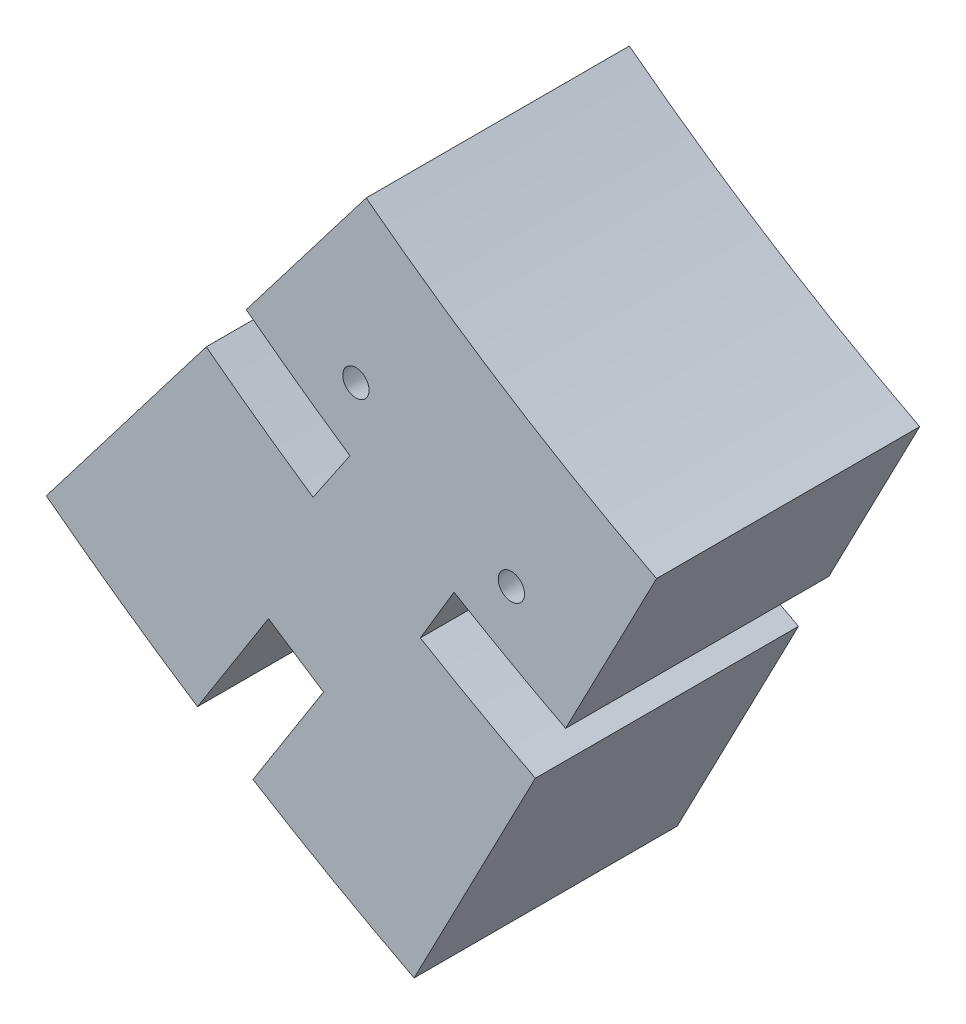
ISO-10303-21;
HEADER;
FILE_DESCRIPTION(('STEP AP214'),'2;1');
FILE_NAME('part.step','',(''),(''),'','','');
FILE_SCHEMA(('AUTOMOTIVE_DESIGN { 1 0 10303 214 1 1 1 1 }'));
ENDSEC;
DATA;
#1=APPLICATION_CONTEXT('core data for automotive mechanical design processes');
#2=APPLICATION_PROTOCOL_DEFINITION('international standard','automotive_design',2000,#1);
#3=PRODUCT_CONTEXT('',#1,'mechanical');
#4=PRODUCT('Part','Part','',(#3));
#5=PRODUCT_RELATED_PRODUCT_CATEGORY('part','',(#4));
#6=PRODUCT_DEFINITION_FORMATION('','',#4);
#7=PRODUCT_DEFINITION_CONTEXT('part definition',#1,'design');
#8=PRODUCT_DEFINITION('design','',#6,#7);
#9=PRODUCT_DEFINITION_SHAPE('','',#8);
#10=(LENGTH_UNIT() NAMED_UNIT(*) SI_UNIT(.MILLI.,.METRE.));
#11=(NAMED_UNIT(*) PLANE_ANGLE_UNIT() SI_UNIT($,.RADIAN.));
#12=(NAMED_UNIT(*) SI_UNIT($,.STERADIAN.) SOLID_ANGLE_UNIT());
#13=UNCERTAINTY_MEASURE_WITH_UNIT(LENGTH_MEASURE(1.E-05),#10,'distance_accuracy_value','');
#14=(GEOMETRIC_REPRESENTATION_CONTEXT(3) GLOBAL_UNCERTAINTY_ASSIGNED_CONTEXT((#13)) GLOBAL_UNIT_ASSIGNED_CONTEXT((#10,
#11,#12)) REPRESENTATION_CONTEXT('',''));
#15=CARTESIAN_POINT('',(0.,0.,0.));
#16=DIRECTION('',(0.,0.,1.));
#17=DIRECTION('',(1.,0.,0.));
#18=AXIS2_PLACEMENT_3D('',#15,#16,#17);
#19=CARTESIAN_POINT('',(-455.837805225456,-595.576943246831,100.));
#20=DIRECTION('',(0.794102590995776,-0.607783740300608,0.));
#21=DIRECTION('',(0.607783740300607,0.794102590995775,0.));
#22=AXIS2_PLACEMENT_3D('',#19,#20,#21);
#23=PLANE('',#22);
#24=DIRECTION('',(-0.607783740300608,-0.794102590995776,0.));
#25=VECTOR('',#24,1.);
#26=CARTESIAN_POINT('',(-455.837805225456,-595.576943246831,0.));
#27=LINE('',#26,#25);
#28=CARTESIAN_POINT('',(-455.837805225456,-595.576943246831,0.));
#29=VERTEX_POINT('',#28);
#30=CARTESIAN_POINT('',(-501.421585748001,-655.134637571515,0.));
#31=VERTEX_POINT('',#30);
#32=EDGE_CURVE('E164',#29,#31,#27,.T.);
#33=ORIENTED_EDGE('',*,*,#32,.T.);
#34=DIRECTION('',(0.,0.,1.));
#35=VECTOR('',#34,1.);
#36=CARTESIAN_POINT('',(-501.421585748001,-655.134637571515,0.));
#37=LINE('',#36,#35);
#38=CARTESIAN_POINT('',(-501.421585748001,-655.134637571515,100.));
#39=VERTEX_POINT('',#38);
#40=EDGE_CURVE('E149',#31,#39,#37,.T.);
#41=ORIENTED_EDGE('',*,*,#40,.T.);
#42=DIRECTION('',(-0.607783740300608,-0.794102590995776,0.));
#43=VECTOR('',#42,1.);
#44=CARTESIAN_POINT('',(-455.837805225456,-595.576943246831,100.));
#45=LINE('',#44,#43);
#46=CARTESIAN_POINT('',(-455.837805225456,-595.576943246831,100.));
#47=VERTEX_POINT('',#46);
#48=EDGE_CURVE('E236',#47,#39,#45,.T.);
#49=ORIENTED_EDGE('',*,*,#48,.F.);
#50=DIRECTION('',(0.,0.,-1.));
#51=VECTOR('',#50,1.);
#52=CARTESIAN_POINT('',(-455.837805225456,-595.576943246831,100.));
#53=LINE('',#52,#51);
#54=EDGE_CURVE('E11',#47,#29,#53,.T.);
#55=ORIENTED_EDGE('',*,*,#54,.T.);
#56=EDGE_LOOP('',(#33,#41,#49,#55));
#57=FACE_BOUND('',#56,.T.);
#58=ADVANCED_FACE('F36',(#57),#23,.F.);
#59=CARTESIAN_POINT('',(-345.491753846844,-665.684195413885,100.));
#60=DIRECTION('',(-0.887578927218514,0.460655671795792,0.));
#61=DIRECTION('',(-0.460655671795792,-0.887578927218513,0.));
#62=AXIS2_PLACEMENT_3D('',#59,#60,#61);
#63=PLANE('',#62);
#64=DIRECTION('',(0.460655671795792,0.887578927218514,0.));
#65=VECTOR('',#64,1.);
#66=CARTESIAN_POINT('',(-345.491753846844,-665.684195413885,100.));
#67=LINE('',#66,#65);
#68=CARTESIAN_POINT('',(-380.040929231529,-732.252614955274,100.));
#69=VERTEX_POINT('',#68);
#70=CARTESIAN_POINT('',(-345.491753846844,-665.684195413885,100.));
#71=VERTEX_POINT('',#70);
#72=EDGE_CURVE('E239',#69,#71,#67,.T.);
#73=ORIENTED_EDGE('',*,*,#72,.F.);
#74=DIRECTION('',(0.,0.,1.));
#75=VECTOR('',#74,1.);
#76=CARTESIAN_POINT('',(-380.040929231529,-732.252614955274,0.));
#77=LINE('',#76,#75);
#78=CARTESIAN_POINT('',(-380.040929231529,-732.252614955274,0.));
#79=VERTEX_POINT('',#78);
#80=EDGE_CURVE('E276',#79,#69,#77,.T.);
#81=ORIENTED_EDGE('',*,*,#80,.F.);
#82=DIRECTION('',(0.460655671795792,0.887578927218514,0.));
#83=VECTOR('',#82,1.);
#84=CARTESIAN_POINT('',(-345.491753846844,-665.684195413885,0.));
#85=LINE('',#84,#83);
#86=CARTESIAN_POINT('',(-345.491753846844,-665.684195413885,0.));
#87=VERTEX_POINT('',#86);
#88=EDGE_CURVE('E181',#79,#87,#85,.T.);
#89=ORIENTED_EDGE('',*,*,#88,.T.);
#90=DIRECTION('',(0.,0.,-1.));
#91=VECTOR('',#90,1.);
#92=CARTESIAN_POINT('',(-345.491753846844,-665.684195413885,100.));
#93=LINE('',#92,#91);
#94=EDGE_CURVE('E186',#71,#87,#93,.T.);
#95=ORIENTED_EDGE('',*,*,#94,.F.);
#96=EDGE_LOOP('',(#73,#81,#89,#95));
#97=FACE_BOUND('',#96,.T.);
#98=ADVANCED_FACE('F255',(#97),#63,.F.);
#99=CARTESIAN_POINT('',(0.,0.,100.));
#100=DIRECTION('',(0.,0.,-1.));
#101=DIRECTION('',(-1.,0.,0.));
#102=AXIS2_PLACEMENT_3D('',#99,#100,#101);
#103=CYLINDRICAL_SURFACE('',#102,950.);
#104=CARTESIAN_POINT('',(0.,0.,0.));
#105=DIRECTION('',(0.,0.,1.));
#106=DIRECTION('',(1.,0.,0.));
#107=AXIS2_PLACEMENT_3D('',#104,#105,#106);
#108=CIRCLE('',#107,950.);
#109=CARTESIAN_POINT('',(-577.394553285577,-754.397461445987,0.));
#110=VERTEX_POINT('',#109);
#111=CARTESIAN_POINT('',(-519.950393133908,-795.079611535785,0.));
#112=VERTEX_POINT('',#111);
#113=EDGE_CURVE('E174',#110,#112,#108,.T.);
#114=ORIENTED_EDGE('',*,*,#113,.T.);
#115=DIRECTION('',(0.,0.,1.));
#116=VECTOR('',#115,1.);
#117=CARTESIAN_POINT('',(-519.950393133908,-795.079611535785,0.));
#118=LINE('',#117,#116);
#119=CARTESIAN_POINT('',(-519.950393133908,-795.079611535785,100.));
#120=VERTEX_POINT('',#119);
#121=EDGE_CURVE('E228',#112,#120,#118,.T.);
#122=ORIENTED_EDGE('',*,*,#121,.T.);
#123=CARTESIAN_POINT('',(0.,0.,100.));
#124=DIRECTION('',(0.,0.,1.));
#125=DIRECTION('',(1.,0.,0.));
#126=AXIS2_PLACEMENT_3D('',#123,#124,#125);
#127=CIRCLE('',#126,950.);
#128=CARTESIAN_POINT('',(-577.394553285577,-754.397461445987,100.));
#129=VERTEX_POINT('',#128);
#130=EDGE_CURVE('E200',#129,#120,#127,.T.);
#131=ORIENTED_EDGE('',*,*,#130,.F.);
#132=DIRECTION('',(0.,0.,-1.));
#133=VECTOR('',#132,1.);
#134=CARTESIAN_POINT('',(-577.394553285577,-754.397461445987,100.));
#135=LINE('',#134,#133);
#136=EDGE_CURVE('E44',#129,#110,#135,.T.);
#137=ORIENTED_EDGE('',*,*,#136,.T.);
#138=EDGE_LOOP('',(#114,#122,#131,#137));
#139=FACE_BOUND('',#138,.T.);
#140=ADVANCED_FACE('F197',(#139),#103,.T.);
#141=CARTESIAN_POINT('',(0.,0.,100.));
#142=DIRECTION('',(0.,0.,-1.));
#143=DIRECTION('',(-1.,0.,0.));
#144=AXIS2_PLACEMENT_3D('',#141,#142,#143);
#145=CYLINDRICAL_SURFACE('',#144,750.);
#146=CARTESIAN_POINT('',(0.,0.,0.));
#147=DIRECTION('',(0.,0.,-1.));
#148=DIRECTION('',(1.,0.,0.));
#149=AXIS2_PLACEMENT_3D('',#146,#147,#148);
#150=CIRCLE('',#149,750.);
#151=EDGE_CURVE('E176',#87,#29,#150,.T.);
#152=ORIENTED_EDGE('',*,*,#151,.T.);
#153=ORIENTED_EDGE('',*,*,#54,.F.);
#154=CARTESIAN_POINT('',(0.,0.,100.));
#155=DIRECTION('',(0.,0.,-1.));
#156=DIRECTION('',(1.,0.,0.));
#157=AXIS2_PLACEMENT_3D('',#154,#155,#156);
#158=CIRCLE('',#157,750.);
#159=EDGE_CURVE('E185',#71,#47,#158,.T.);
#160=ORIENTED_EDGE('',*,*,#159,.F.);
#161=ORIENTED_EDGE('',*,*,#94,.T.);
#162=EDGE_LOOP('',(#152,#153,#160,#161));
#163=FACE_BOUND('',#162,.T.);
#164=ADVANCED_FACE('F38',(#163),#145,.F.);
#165=CARTESIAN_POINT('',(-516.607469042515,-674.975821978272,100.));
#166=VERTEX_POINT('',#165);
#167=EDGE_CURVE('E235',#166,#129,#45,.T.);
#168=ORIENTED_EDGE('',*,*,#167,.F.);
#169=DIRECTION('',(0.,0.,1.));
#170=VECTOR('',#169,1.);
#171=CARTESIAN_POINT('',(-516.607469042515,-674.975821978272,0.));
#172=LINE('',#171,#170);
#173=CARTESIAN_POINT('',(-516.607469042515,-674.975821978272,0.));
#174=VERTEX_POINT('',#173);
#175=EDGE_CURVE('E158',#174,#166,#172,.T.);
#176=ORIENTED_EDGE('',*,*,#175,.F.);
#177=EDGE_CURVE('E172',#174,#110,#27,.T.);
#178=ORIENTED_EDGE('',*,*,#177,.T.);
#179=ORIENTED_EDGE('',*,*,#136,.F.);
#180=EDGE_LOOP('',(#168,#176,#178,#179));
#181=FACE_BOUND('',#180,.T.);
#182=ADVANCED_FACE('F322',(#181),#23,.F.);
#183=CARTESIAN_POINT('',(-498.852561417557,-808.483841500337,100.));
#184=VERTEX_POINT('',#183);
#185=CARTESIAN_POINT('',(-437.622888206003,-843.199980857588,100.));
#186=VERTEX_POINT('',#185);
#187=EDGE_CURVE('E238',#184,#186,#127,.T.);
#188=ORIENTED_EDGE('',*,*,#187,.F.);
#189=DIRECTION('',(0.,0.,1.));
#190=VECTOR('',#189,1.);
#191=CARTESIAN_POINT('',(-498.852561417557,-808.483841500337,0.));
#192=LINE('',#191,#190);
#193=CARTESIAN_POINT('',(-498.852561417557,-808.483841500337,0.));
#194=VERTEX_POINT('',#193);
#195=EDGE_CURVE('E211',#194,#184,#192,.T.);
#196=ORIENTED_EDGE('',*,*,#195,.F.);
#197=CARTESIAN_POINT('',(-437.622888206003,-843.199980857588,0.));
#198=VERTEX_POINT('',#197);
#199=EDGE_CURVE('E171',#194,#198,#108,.T.);
#200=ORIENTED_EDGE('',*,*,#199,.T.);
#201=DIRECTION('',(0.,0.,-1.));
#202=VECTOR('',#201,1.);
#203=CARTESIAN_POINT('',(-437.622888206003,-843.199980857588,100.));
#204=LINE('',#203,#202);
#205=EDGE_CURVE('E189',#186,#198,#204,.T.);
#206=ORIENTED_EDGE('',*,*,#205,.F.);
#207=EDGE_LOOP('',(#188,#196,#200,#206));
#208=FACE_BOUND('',#207,.T.);
#209=ADVANCED_FACE('F310',(#208),#103,.T.);
#210=CARTESIAN_POINT('',(-391.550719321318,-754.429368148349,0.));
#211=VERTEX_POINT('',#210);
#212=EDGE_CURVE('E182',#198,#211,#85,.T.);
#213=ORIENTED_EDGE('',*,*,#212,.T.);
#214=DIRECTION('',(0.,0.,1.));
#215=VECTOR('',#214,1.);
#216=CARTESIAN_POINT('',(-391.550719321318,-754.429368148349,0.));
#217=LINE('',#216,#215);
#218=CARTESIAN_POINT('',(-391.550719321318,-754.429368148349,100.));
#219=VERTEX_POINT('',#218);
#220=EDGE_CURVE('E278',#211,#219,#217,.T.);
#221=ORIENTED_EDGE('',*,*,#220,.T.);
#222=EDGE_CURVE('E190',#186,#219,#67,.T.);
#223=ORIENTED_EDGE('',*,*,#222,.F.);
#224=ORIENTED_EDGE('',*,*,#205,.T.);
#225=EDGE_LOOP('',(#213,#221,#223,#224));
#226=FACE_BOUND('',#225,.T.);
#227=ADVANCED_FACE('F349',(#226),#63,.F.);
#228=CARTESIAN_POINT('',(0.,0.,100.));
#229=DIRECTION('',(0.,0.,1.));
#230=DIRECTION('',(1.,0.,0.));
#231=AXIS2_PLACEMENT_3D('',#228,#229,#230);
#232=PLANE('',#231);
#233=CARTESIAN_POINT('',(0.,0.,100.));
#234=DIRECTION('',(0.,0.,-1.));
#235=DIRECTION('',(1.,0.,0.));
#236=AXIS2_PLACEMENT_3D('',#233,#234,#235);
#237=CIRCLE('',#236,825.);
#238=CARTESIAN_POINT('',(-462.015311929239,-683.496050861253,100.));
#239=VERTEX_POINT('',#238);
#240=EDGE_CURVE('E154',#239,#39,#237,.T.);
#241=ORIENTED_EDGE('',*,*,#240,.F.);
#242=DIRECTION('',(0.560018559914229,0.828480061650003,0.));
#243=VECTOR('',#242,1.);
#244=CARTESIAN_POINT('',(-462.015311929239,-683.496050861253,100.));
#245=LINE('',#244,#243);
#246=CARTESIAN_POINT('',(-476.007750241941,-704.196179367201,100.));
#247=VERTEX_POINT('',#246);
#248=EDGE_CURVE('E167',#247,#239,#245,.T.);
#249=ORIENTED_EDGE('',*,*,#248,.F.);
#250=CARTESIAN_POINT('',(0.,0.,100.));
#251=DIRECTION('',(0.,0.,1.));
#252=DIRECTION('',(1.,0.,0.));
#253=AXIS2_PLACEMENT_3D('',#250,#251,#252);
#254=CIRCLE('',#253,849.985668894339);
#255=EDGE_CURVE('E320',#166,#247,#254,.T.);
#256=ORIENTED_EDGE('',*,*,#255,.F.);
#257=ORIENTED_EDGE('',*,*,#167,.T.);
#258=ORIENTED_EDGE('',*,*,#130,.T.);
#259=DIRECTION('',(-0.536190517040364,-0.844096990538402,0.));
#260=VECTOR('',#259,1.);
#261=CARTESIAN_POINT('',(-492.967880597618,-752.602438021482,100.));
#262=LINE('',#261,#260);
#263=CARTESIAN_POINT('',(-492.967880597618,-752.602438021482,100.));
#264=VERTEX_POINT('',#263);
#265=EDGE_CURVE('E226',#264,#120,#262,.T.);
#266=ORIENTED_EDGE('',*,*,#265,.F.);
#267=DIRECTION('',(-0.837063770457734,0.547105331894219,0.));
#268=VECTOR('',#267,1.);
#269=CARTESIAN_POINT('',(-492.967880597618,-752.602438021482,100.));
#270=LINE('',#269,#268);
#271=CARTESIAN_POINT('',(-472.039544490669,-766.281209789999,100.));
#272=VERTEX_POINT('',#271);
#273=EDGE_CURVE('E222',#272,#264,#270,.T.);
#274=ORIENTED_EDGE('',*,*,#273,.F.);
#275=DIRECTION('',(0.536260338537758,0.844052634206759,0.));
#276=VECTOR('',#275,1.);
#277=CARTESIAN_POINT('',(-472.039544490669,-766.281209789999,100.));
#278=LINE('',#277,#276);
#279=EDGE_CURVE('E219',#184,#272,#278,.T.);
#280=ORIENTED_EDGE('',*,*,#279,.F.);
#281=ORIENTED_EDGE('',*,*,#187,.T.);
#282=ORIENTED_EDGE('',*,*,#222,.T.);
#283=CARTESIAN_POINT('',(0.,0.,100.));
#284=DIRECTION('',(0.,0.,1.));
#285=DIRECTION('',(1.,0.,0.));
#286=AXIS2_PLACEMENT_3D('',#283,#284,#285);
#287=CIRCLE('',#286,849.985668894339);
#288=CARTESIAN_POINT('',(-435.25090703542,-730.090600713776,100.));
#289=VERTEX_POINT('',#288);
#290=EDGE_CURVE('E264',#289,#219,#287,.T.);
#291=ORIENTED_EDGE('',*,*,#290,.F.);
#292=DIRECTION('',(-0.51206852416888,-0.858944600399528,0.));
#293=VECTOR('',#292,1.);
#294=CARTESIAN_POINT('',(-422.456532439323,-708.629295329613,100.));
#295=LINE('',#294,#293);
#296=CARTESIAN_POINT('',(-422.456532439323,-708.629295329613,100.));
#297=VERTEX_POINT('',#296);
#298=EDGE_CURVE('E267',#297,#289,#295,.T.);
#299=ORIENTED_EDGE('',*,*,#298,.F.);
#300=CARTESIAN_POINT('',(0.,0.,100.));
#301=DIRECTION('',(0.,0.,-1.));
#302=DIRECTION('',(1.,0.,0.));
#303=AXIS2_PLACEMENT_3D('',#300,#301,#302);
#304=CIRCLE('',#303,825.);
#305=EDGE_CURVE('E252',#69,#297,#304,.T.);
#306=ORIENTED_EDGE('',*,*,#305,.F.);
#307=ORIENTED_EDGE('',*,*,#72,.T.);
#308=ORIENTED_EDGE('',*,*,#159,.T.);
#309=ORIENTED_EDGE('',*,*,#48,.T.);
#310=EDGE_LOOP('',(#241,#249,#256,#257,#258,#266,#274,#280,#281,#282,#291,#299,#306,#307,#308,#309));
#311=FACE_BOUND('',#310,.T.);
#312=CARTESIAN_POINT('',(-400.653536752147,-695.879680599631,100.));
#313=DIRECTION('',(0.,0.,-1.));
#314=DIRECTION('',(-0.424849698622738,0.905263902726806,0.));
#315=AXIS2_PLACEMENT_3D('',#312,#313,#314);
#316=CIRCLE('',#315,5.0000000000001);
#317=CARTESIAN_POINT('',(-398.529288259033,-700.406000113265,100.));
#318=VERTEX_POINT('',#317);
#319=EDGE_CURVE('E291',#318,#318,#316,.T.);
#320=ORIENTED_EDGE('',*,*,#319,.T.);
#321=EDGE_LOOP('',(#320));
#322=FACE_BOUND('',#321,.T.);
#323=CARTESIAN_POINT('',(-459.737221146621,-658.341456901987,100.));
#324=DIRECTION('',(0.,0.,1.));
#325=DIRECTION('',(1.,0.,0.));
#326=AXIS2_PLACEMENT_3D('',#323,#324,#325);
#327=CIRCLE('',#326,5.0000000000001);
#328=CARTESIAN_POINT('',(-454.737221146621,-658.341456901987,100.));
#329=VERTEX_POINT('',#328);
#330=EDGE_CURVE('E223',#329,#329,#327,.T.);
#331=ORIENTED_EDGE('',*,*,#330,.F.);
#332=EDGE_LOOP('',(#331));
#333=FACE_BOUND('',#332,.T.);
#334=ADVANCED_FACE('F247',(#311,#322,#333),#232,.T.);
#335=CARTESIAN_POINT('',(0.,0.,0.));
#336=DIRECTION('',(0.,0.,1.));
#337=DIRECTION('',(1.,0.,0.));
#338=AXIS2_PLACEMENT_3D('',#335,#336,#337);
#339=PLANE('',#338);
#340=DIRECTION('',(0.560018559914229,0.828480061650003,0.));
#341=VECTOR('',#340,1.);
#342=CARTESIAN_POINT('',(-462.015311929239,-683.496050861253,0.));
#343=LINE('',#342,#341);
#344=CARTESIAN_POINT('',(-476.007750241941,-704.196179367201,0.));
#345=VERTEX_POINT('',#344);
#346=CARTESIAN_POINT('',(-462.015311929239,-683.496050861253,0.));
#347=VERTEX_POINT('',#346);
#348=EDGE_CURVE('E51',#345,#347,#343,.T.);
#349=ORIENTED_EDGE('',*,*,#348,.T.);
#350=CARTESIAN_POINT('',(0.,0.,0.));
#351=DIRECTION('',(0.,0.,-1.));
#352=DIRECTION('',(1.,0.,0.));
#353=AXIS2_PLACEMENT_3D('',#350,#351,#352);
#354=CIRCLE('',#353,825.);
#355=EDGE_CURVE('E152',#347,#31,#354,.T.);
#356=ORIENTED_EDGE('',*,*,#355,.T.);
#357=ORIENTED_EDGE('',*,*,#32,.F.);
#358=ORIENTED_EDGE('',*,*,#151,.F.);
#359=ORIENTED_EDGE('',*,*,#88,.F.);
#360=CARTESIAN_POINT('',(0.,0.,0.));
#361=DIRECTION('',(0.,0.,-1.));
#362=DIRECTION('',(1.,0.,0.));
#363=AXIS2_PLACEMENT_3D('',#360,#361,#362);
#364=CIRCLE('',#363,825.);
#365=CARTESIAN_POINT('',(-422.456532439323,-708.629295329613,0.));
#366=VERTEX_POINT('',#365);
#367=EDGE_CURVE('E260',#79,#366,#364,.T.);
#368=ORIENTED_EDGE('',*,*,#367,.T.);
#369=DIRECTION('',(-0.51206852416888,-0.858944600399528,0.));
#370=VECTOR('',#369,1.);
#371=CARTESIAN_POINT('',(-422.456532439323,-708.629295329613,0.));
#372=LINE('',#371,#370);
#373=CARTESIAN_POINT('',(-435.250907035424,-730.090600713776,0.));
#374=VERTEX_POINT('',#373);
#375=EDGE_CURVE('E262',#366,#374,#372,.T.);
#376=ORIENTED_EDGE('',*,*,#375,.T.);
#377=CARTESIAN_POINT('',(0.,0.,0.));
#378=DIRECTION('',(0.,0.,1.));
#379=DIRECTION('',(1.,0.,0.));
#380=AXIS2_PLACEMENT_3D('',#377,#378,#379);
#381=CIRCLE('',#380,849.985668894339);
#382=EDGE_CURVE('E59',#374,#211,#381,.T.);
#383=ORIENTED_EDGE('',*,*,#382,.T.);
#384=ORIENTED_EDGE('',*,*,#212,.F.);
#385=ORIENTED_EDGE('',*,*,#199,.F.);
#386=DIRECTION('',(0.536260338537758,0.844052634206759,0.));
#387=VECTOR('',#386,1.);
#388=CARTESIAN_POINT('',(-472.039544490669,-766.281209789999,0.));
#389=LINE('',#388,#387);
#390=CARTESIAN_POINT('',(-472.039544490669,-766.281209789999,0.));
#391=VERTEX_POINT('',#390);
#392=EDGE_CURVE('E215',#194,#391,#389,.T.);
#393=ORIENTED_EDGE('',*,*,#392,.T.);
#394=DIRECTION('',(-0.837063770457734,0.547105331894219,0.));
#395=VECTOR('',#394,1.);
#396=CARTESIAN_POINT('',(-492.967880597618,-752.602438021482,0.));
#397=LINE('',#396,#395);
#398=CARTESIAN_POINT('',(-492.967880597618,-752.602438021482,0.));
#399=VERTEX_POINT('',#398);
#400=EDGE_CURVE('E209',#391,#399,#397,.T.);
#401=ORIENTED_EDGE('',*,*,#400,.T.);
#402=DIRECTION('',(-0.536190517040364,-0.844096990538402,0.));
#403=VECTOR('',#402,1.);
#404=CARTESIAN_POINT('',(-492.967880597618,-752.602438021482,0.));
#405=LINE('',#404,#403);
#406=EDGE_CURVE('E207',#399,#112,#405,.T.);
#407=ORIENTED_EDGE('',*,*,#406,.T.);
#408=ORIENTED_EDGE('',*,*,#113,.F.);
#409=ORIENTED_EDGE('',*,*,#177,.F.);
#410=CARTESIAN_POINT('',(0.,0.,0.));
#411=DIRECTION('',(0.,0.,1.));
#412=DIRECTION('',(1.,0.,0.));
#413=AXIS2_PLACEMENT_3D('',#410,#411,#412);
#414=CIRCLE('',#413,849.985668894339);
#415=EDGE_CURVE('E166',#174,#345,#414,.T.);
#416=ORIENTED_EDGE('',*,*,#415,.T.);
#417=EDGE_LOOP('',(#349,#356,#357,#358,#359,#368,#376,#383,#384,#385,#393,#401,#407,#408,#409,#416));
#418=FACE_BOUND('',#417,.T.);
#419=CARTESIAN_POINT('',(-400.653536752147,-695.879680599631,0.));
#420=DIRECTION('',(0.,0.,-1.));
#421=DIRECTION('',(-0.424849698622738,0.905263902726806,0.));
#422=AXIS2_PLACEMENT_3D('',#419,#420,#421);
#423=CIRCLE('',#422,13.6824088833465);
#424=CARTESIAN_POINT('',(-406.46650404267,-683.493489735188,0.));
#425=VERTEX_POINT('',#424);
#426=EDGE_CURVE('E284',#425,#425,#423,.T.);
#427=ORIENTED_EDGE('',*,*,#426,.F.);
#428=EDGE_LOOP('',(#427));
#429=FACE_BOUND('',#428,.T.);
#430=CARTESIAN_POINT('',(-459.737221146621,-658.341456901987,0.));
#431=DIRECTION('',(0.,0.,1.));
#432=DIRECTION('',(1.,0.,0.));
#433=AXIS2_PLACEMENT_3D('',#430,#431,#432);
#434=CIRCLE('',#433,13.6824088833465);
#435=CARTESIAN_POINT('',(-446.054812263275,-658.341456901987,0.));
#436=VERTEX_POINT('',#435);
#437=EDGE_CURVE('E294',#436,#436,#434,.T.);
#438=ORIENTED_EDGE('',*,*,#437,.T.);
#439=EDGE_LOOP('',(#438));
#440=FACE_BOUND('',#439,.T.);
#441=ADVANCED_FACE('F161',(#418,#429,#440),#339,.F.);
#442=CARTESIAN_POINT('',(-492.967880597618,-752.602438021482,0.));
#443=DIRECTION('',(-0.844096990538402,0.536190517040364,0.));
#444=DIRECTION('',(-0.536190517040364,-0.844096990538402,0.));
#445=AXIS2_PLACEMENT_3D('',#442,#443,#444);
#446=PLANE('',#445);
#447=ORIENTED_EDGE('',*,*,#265,.T.);
#448=ORIENTED_EDGE('',*,*,#121,.F.);
#449=ORIENTED_EDGE('',*,*,#406,.F.);
#450=DIRECTION('',(0.,0.,1.));
#451=VECTOR('',#450,1.);
#452=CARTESIAN_POINT('',(-492.967880597618,-752.602438021482,0.));
#453=LINE('',#452,#451);
#454=EDGE_CURVE('E230',#399,#264,#453,.T.);
#455=ORIENTED_EDGE('',*,*,#454,.T.);
#456=EDGE_LOOP('',(#447,#448,#449,#455));
#457=FACE_BOUND('',#456,.T.);
#458=ADVANCED_FACE('F316',(#457),#446,.F.);
#459=CARTESIAN_POINT('',(-492.967880597618,-752.602438021482,0.));
#460=DIRECTION('',(0.547105331894219,0.837063770457734,0.));
#461=DIRECTION('',(-0.837063770457734,0.547105331894219,0.));
#462=AXIS2_PLACEMENT_3D('',#459,#460,#461);
#463=PLANE('',#462);
#464=ORIENTED_EDGE('',*,*,#273,.T.);
#465=ORIENTED_EDGE('',*,*,#454,.F.);
#466=ORIENTED_EDGE('',*,*,#400,.F.);
#467=DIRECTION('',(0.,0.,1.));
#468=VECTOR('',#467,1.);
#469=CARTESIAN_POINT('',(-472.039544490669,-766.281209789999,0.));
#470=LINE('',#469,#468);
#471=EDGE_CURVE('E213',#391,#272,#470,.T.);
#472=ORIENTED_EDGE('',*,*,#471,.T.);
#473=EDGE_LOOP('',(#464,#465,#466,#472));
#474=FACE_BOUND('',#473,.T.);
#475=ADVANCED_FACE('F315',(#474),#463,.F.);
#476=CARTESIAN_POINT('',(-472.039544490669,-766.281209789999,0.));
#477=DIRECTION('',(0.844052634206759,-0.536260338537758,0.));
#478=DIRECTION('',(0.536260338537758,0.844052634206759,0.));
#479=AXIS2_PLACEMENT_3D('',#476,#477,#478);
#480=PLANE('',#479);
#481=ORIENTED_EDGE('',*,*,#279,.T.);
#482=ORIENTED_EDGE('',*,*,#471,.F.);
#483=ORIENTED_EDGE('',*,*,#392,.F.);
#484=ORIENTED_EDGE('',*,*,#195,.T.);
#485=EDGE_LOOP('',(#481,#482,#483,#484));
#486=FACE_BOUND('',#485,.T.);
#487=ADVANCED_FACE('F306',(#486),#480,.F.);
#488=CARTESIAN_POINT('',(-459.737221146621,-658.341456901987,50.7596123493896));
#489=DIRECTION('',(0.,0.,-1.));
#490=DIRECTION('',(-1.,0.,0.));
#491=AXIS2_PLACEMENT_3D('',#488,#489,#490);
#492=CONICAL_SURFACE('',#491,13.6824088833464,0.174532925199429);
#493=ORIENTED_EDGE('',*,*,#330,.T.);
#494=EDGE_LOOP('',(#493));
#495=FACE_BOUND('',#494,.T.);
#496=CARTESIAN_POINT('',(-459.737221146621,-658.341456901987,50.7596123493896));
#497=DIRECTION('',(0.,0.,1.));
#498=DIRECTION('',(1.,0.,0.));
#499=AXIS2_PLACEMENT_3D('',#496,#497,#498);
#500=CIRCLE('',#499,13.6824088833464);
#501=CARTESIAN_POINT('',(-446.054812263275,-658.341456901987,50.7596123493896));
#502=VERTEX_POINT('',#501);
#503=EDGE_CURVE('E297',#502,#502,#500,.T.);
#504=ORIENTED_EDGE('',*,*,#503,.F.);
#505=EDGE_LOOP('',(#504));
#506=FACE_BOUND('',#505,.T.);
#507=ADVANCED_FACE('F370',(#495,#506),#492,.F.);
#508=CARTESIAN_POINT('',(-459.737221146621,-658.341456901987,100.));
#509=DIRECTION('',(0.,0.,1.));
#510=DIRECTION('',(1.,0.,0.));
#511=AXIS2_PLACEMENT_3D('',#508,#509,#510);
#512=CYLINDRICAL_SURFACE('',#511,13.6824088833465);
#513=ORIENTED_EDGE('',*,*,#503,.T.);
#514=EDGE_LOOP('',(#513));
#515=FACE_BOUND('',#514,.T.);
#516=ORIENTED_EDGE('',*,*,#437,.F.);
#517=EDGE_LOOP('',(#516));
#518=FACE_BOUND('',#517,.T.);
#519=ADVANCED_FACE('F377',(#515,#518),#512,.F.);
#520=CARTESIAN_POINT('',(-400.653536752147,-695.879680599631,50.7596123493896));
#521=DIRECTION('',(0.,0.,-1.));
#522=DIRECTION('',(0.424849698622738,-0.905263902726806,0.));
#523=AXIS2_PLACEMENT_3D('',#520,#521,#522);
#524=CONICAL_SURFACE('',#523,13.6824088833464,0.174532925199429);
#525=CARTESIAN_POINT('',(-400.653536752147,-695.879680599631,50.7596123493896));
#526=DIRECTION('',(0.,0.,-1.));
#527=DIRECTION('',(-0.424849698622738,0.905263902726806,0.));
#528=AXIS2_PLACEMENT_3D('',#525,#526,#527);
#529=CIRCLE('',#528,13.6824088833464);
#530=CARTESIAN_POINT('',(-394.840569461624,-708.265871464073,50.7596123493896));
#531=VERTEX_POINT('',#530);
#532=EDGE_CURVE('E287',#531,#531,#529,.T.);
#533=CARTESIAN_POINT('',(-398.529288259033,-700.406000113265,100.));
#534=CARTESIAN_POINT('',(-398.490864104893,-700.487873773169,99.4870792953061));
#535=CARTESIAN_POINT('',(-398.452439950754,-700.569747433073,98.9741585906123));
#536=CARTESIAN_POINT('',(-398.375591642474,-700.733494752882,97.9483171812246));
#537=CARTESIAN_POINT('',(-398.337167488335,-700.815368412786,97.4353964765307));
#538=CARTESIAN_POINT('',(-398.260319180055,-700.979115732594,96.409555067143));
#539=CARTESIAN_POINT('',(-398.221895025916,-701.060989392499,95.8966343624491));
#540=CARTESIAN_POINT('',(-398.145046717636,-701.224736712307,94.8707929530614));
#541=CARTESIAN_POINT('',(-398.106622563497,-701.306610372211,94.3578722483676));
#542=CARTESIAN_POINT('',(-398.029774255217,-701.47035769202,93.3320308389798));
#543=CARTESIAN_POINT('',(-397.991350101078,-701.552231351924,92.819110134286));
#544=CARTESIAN_POINT('',(-397.914501792798,-701.715978671733,91.7932687248983));
#545=CARTESIAN_POINT('',(-397.876077638659,-701.797852331637,91.2803480202044));
#546=CARTESIAN_POINT('',(-397.799229330379,-701.961599651445,90.2545066108167));
#547=CARTESIAN_POINT('',(-397.76080517624,-702.04347331135,89.7415859061228));
#548=CARTESIAN_POINT('',(-397.68395686796,-702.207220631158,88.7157444967351));
#549=CARTESIAN_POINT('',(-397.645532713821,-702.289094291062,88.2028237920413));
#550=CARTESIAN_POINT('',(-397.568684405541,-702.452841610871,87.1769823826535));
#551=CARTESIAN_POINT('',(-397.530260251402,-702.534715270775,86.6640616779597));
#552=CARTESIAN_POINT('',(-397.453411943122,-702.698462590584,85.638220268572));
#553=CARTESIAN_POINT('',(-397.414987788983,-702.780336250488,85.1252995638781));
#554=CARTESIAN_POINT('',(-397.338139480703,-702.944083570296,84.0994581544904));
#555=CARTESIAN_POINT('',(-397.299715326563,-703.025957230201,83.5865374497965));
#556=CARTESIAN_POINT('',(-397.222867018284,-703.189704550009,82.5606960404088));
#557=CARTESIAN_POINT('',(-397.184442864144,-703.271578209914,82.0477753357149));
#558=CARTESIAN_POINT('',(-397.107594555865,-703.435325529722,81.0219339263272));
#559=CARTESIAN_POINT('',(-397.069170401725,-703.517199189626,80.5090132216334));
#560=CARTESIAN_POINT('',(-396.992322093446,-703.680946509435,79.4831718122457));
#561=CARTESIAN_POINT('',(-396.953897939306,-703.762820169339,78.9702511075518));
#562=CARTESIAN_POINT('',(-396.877049631027,-703.926567489147,77.9444096981641));
#563=CARTESIAN_POINT('',(-396.838625476887,-704.008441149052,77.4314889934702));
#564=CARTESIAN_POINT('',(-396.761777168608,-704.17218846886,76.4056475840825));
#565=CARTESIAN_POINT('',(-396.723353014468,-704.254062128764,75.8927268793886));
#566=CARTESIAN_POINT('',(-396.646504706189,-704.417809448573,74.8668854700009));
#567=CARTESIAN_POINT('',(-396.608080552049,-704.499683108477,74.3539647653071));
#568=CARTESIAN_POINT('',(-396.53123224377,-704.663430428286,73.3281233559193));
#569=CARTESIAN_POINT('',(-396.49280808963,-704.74530408819,72.8152026512255));
#570=CARTESIAN_POINT('',(-396.415959781351,-704.909051407999,71.7893612418378));
#571=CARTESIAN_POINT('',(-396.377535627211,-704.990925067903,71.2764405371439));
#572=CARTESIAN_POINT('',(-396.300687318932,-705.154672387711,70.2505991277562));
#573=CARTESIAN_POINT('',(-396.262263164792,-705.236546047615,69.7376784230623));
#574=CARTESIAN_POINT('',(-396.185414856513,-705.400293367424,68.7118370136746));
#575=CARTESIAN_POINT('',(-396.146990702373,-705.482167027328,68.1989163089808));
#576=CARTESIAN_POINT('',(-396.070142394094,-705.645914347137,67.173074899593));
#577=CARTESIAN_POINT('',(-396.031718239954,-705.727788007041,66.6601541948992));
#578=CARTESIAN_POINT('',(-395.954869931675,-705.891535326849,65.6343127855115));
#579=CARTESIAN_POINT('',(-395.916445777535,-705.973408986754,65.1213920808176));
#580=CARTESIAN_POINT('',(-395.839597469256,-706.137156306562,64.0955506714299));
#581=CARTESIAN_POINT('',(-395.801173315116,-706.219029966466,63.582629966736));
#582=CARTESIAN_POINT('',(-395.724325006837,-706.382777286275,62.5567885573483));
#583=CARTESIAN_POINT('',(-395.685900852697,-706.464650946179,62.0438678526545));
#584=CARTESIAN_POINT('',(-395.609052544418,-706.628398265988,61.0180264432667));
#585=CARTESIAN_POINT('',(-395.570628390278,-706.710271925892,60.5051057385729));
#586=CARTESIAN_POINT('',(-395.493780081999,-706.8740192457,59.4792643291852));
#587=CARTESIAN_POINT('',(-395.455355927859,-706.955892905605,58.9663436244913));
#588=CARTESIAN_POINT('',(-395.37850761958,-707.119640225413,57.9405022151036));
#589=CARTESIAN_POINT('',(-395.34008346544,-707.201513885317,57.4275815104097));
#590=CARTESIAN_POINT('',(-395.263235157161,-707.365261205126,56.401740101022));
#591=CARTESIAN_POINT('',(-395.224811003021,-707.44713486503,55.8888193963282));
#592=CARTESIAN_POINT('',(-395.147962694742,-707.610882184839,54.8629779869404));
#593=CARTESIAN_POINT('',(-395.109538540602,-707.692755844743,54.3500572822466));
#594=CARTESIAN_POINT('',(-395.032690232322,-707.856503164552,53.3242158728589));
#595=CARTESIAN_POINT('',(-394.994266078183,-707.938376824456,52.811295168165));
#596=CARTESIAN_POINT('',(-394.917417769903,-708.102124144264,51.7854537587773));
#597=CARTESIAN_POINT('',(-394.878993615764,-708.183997804168,51.2725330540834));
#598=CARTESIAN_POINT('',(-394.840569461624,-708.265871464073,50.7596123493896));
#599=B_SPLINE_CURVE_WITH_KNOTS('',3,(#533,#534,#535,#536,#537,#538,#539,#540,#541,#542,#543,
#544,#545,#546,#547,#548,#549,#550,#551,#552,#553,#554,#555,#556,#557,#558,#559,#560,#561,#562,
#563,#564,#565,#566,#567,#568,#569,#570,#571,#572,#573,#574,#575,#576,#577,#578,#579,#580,#581,
#582,#583,#584,#585,#586,#587,#588,#589,#590,#591,#592,#593,#594,#595,#596,#597,#598),
.UNSPECIFIED.,.F.,.F.,(4,2,2,2,2,2,2,2,2,2,2,2,2,2,2,2,2,2,2,2,2,2,2,2,2,2,2,2,2,2,2,2,4),(0.,
1.56249999999999,3.12500000000001,4.6875,6.25000000000001,7.8125,9.37499999999999,10.9375,12.5,
14.0625,15.625,17.1875,18.75,20.3125,21.875,23.4375,25.,26.5625,28.125,29.6875,31.25,32.8125,
34.375,35.9375,37.5,39.0625,40.625,42.1875,43.75,45.3125,46.875,48.4375,50.),.UNSPECIFIED.);
#600=EDGE_CURVE('BSEAM381',#318,#531,#599,.T.);
#601=ORIENTED_EDGE('',*,*,#319,.F.);
#602=ORIENTED_EDGE('',*,*,#532,.T.);
#603=ORIENTED_EDGE('',*,*,#600,.T.);
#604=ORIENTED_EDGE('',*,*,#600,.F.);
#605=EDGE_LOOP('',(#601,#603,#602,#604));
#606=FACE_BOUND('',#605,.T.);
#607=ADVANCED_FACE('F381',(#606),#524,.F.);
#608=CARTESIAN_POINT('',(-400.653536752147,-695.879680599631,100.));
#609=DIRECTION('',(0.,0.,1.));
#610=DIRECTION('',(-0.424849698622738,0.905263902726806,0.));
#611=AXIS2_PLACEMENT_3D('',#608,#609,#610);
#612=CYLINDRICAL_SURFACE('',#611,13.6824088833465);
#613=ORIENTED_EDGE('',*,*,#532,.F.);
#614=EDGE_LOOP('',(#613));
#615=FACE_BOUND('',#614,.T.);
#616=ORIENTED_EDGE('',*,*,#426,.T.);
#617=EDGE_LOOP('',(#616));
#618=FACE_BOUND('',#617,.T.);
#619=ADVANCED_FACE('F385',(#615,#618),#612,.F.);
#620=CARTESIAN_POINT('',(0.,0.,0.));
#621=DIRECTION('',(0.,0.,1.));
#622=DIRECTION('',(1.,0.,0.));
#623=AXIS2_PLACEMENT_3D('',#620,#621,#622);
#624=CYLINDRICAL_SURFACE('',#623,825.);
#625=ORIENTED_EDGE('',*,*,#305,.T.);
#626=DIRECTION('',(0.,0.,1.));
#627=VECTOR('',#626,1.);
#628=CARTESIAN_POINT('',(-422.456532439323,-708.629295329613,0.));
#629=LINE('',#628,#627);
#630=EDGE_CURVE('E272',#366,#297,#629,.T.);
#631=ORIENTED_EDGE('',*,*,#630,.F.);
#632=ORIENTED_EDGE('',*,*,#367,.F.);
#633=ORIENTED_EDGE('',*,*,#80,.T.);
#634=EDGE_LOOP('',(#625,#631,#632,#633));
#635=FACE_BOUND('',#634,.T.);
#636=ADVANCED_FACE('F389',(#635),#624,.T.);
#637=CARTESIAN_POINT('',(0.,0.,0.));
#638=DIRECTION('',(0.,0.,1.));
#639=DIRECTION('',(1.,0.,0.));
#640=AXIS2_PLACEMENT_3D('',#637,#638,#639);
#641=CYLINDRICAL_SURFACE('',#640,849.985668894339);
#642=ORIENTED_EDGE('',*,*,#290,.T.);
#643=ORIENTED_EDGE('',*,*,#220,.F.);
#644=ORIENTED_EDGE('',*,*,#382,.F.);
#645=DIRECTION('',(0.,0.,1.));
#646=VECTOR('',#645,1.);
#647=CARTESIAN_POINT('',(-435.25090703542,-730.090600713776,0.));
#648=LINE('',#647,#646);
#649=EDGE_CURVE('E281',#374,#289,#648,.T.);
#650=ORIENTED_EDGE('',*,*,#649,.T.);
#651=EDGE_LOOP('',(#642,#643,#644,#650));
#652=FACE_BOUND('',#651,.T.);
#653=ADVANCED_FACE('F393',(#652),#641,.F.);
#654=CARTESIAN_POINT('',(-422.456532439323,-708.629295329613,0.));
#655=DIRECTION('',(-0.858944600399528,0.51206852416888,0.));
#656=DIRECTION('',(-0.51206852416888,-0.858944600399528,0.));
#657=AXIS2_PLACEMENT_3D('',#654,#655,#656);
#658=PLANE('',#657);
#659=ORIENTED_EDGE('',*,*,#298,.T.);
#660=ORIENTED_EDGE('',*,*,#649,.F.);
#661=ORIENTED_EDGE('',*,*,#375,.F.);
#662=ORIENTED_EDGE('',*,*,#630,.T.);
#663=EDGE_LOOP('',(#659,#660,#661,#662));
#664=FACE_BOUND('',#663,.T.);
#665=ADVANCED_FACE('F342',(#664),#658,.F.);
#666=CARTESIAN_POINT('',(0.,0.,0.));
#667=DIRECTION('',(0.,0.,1.));
#668=DIRECTION('',(1.,0.,0.));
#669=AXIS2_PLACEMENT_3D('',#666,#667,#668);
#670=CYLINDRICAL_SURFACE('',#669,825.);
#671=ORIENTED_EDGE('',*,*,#240,.T.);
#672=ORIENTED_EDGE('',*,*,#40,.F.);
#673=ORIENTED_EDGE('',*,*,#355,.F.);
#674=DIRECTION('',(0.,0.,1.));
#675=VECTOR('',#674,1.);
#676=CARTESIAN_POINT('',(-462.015311929239,-683.496050861253,0.));
#677=LINE('',#676,#675);
#678=EDGE_CURVE('E288',#347,#239,#677,.T.);
#679=ORIENTED_EDGE('',*,*,#678,.T.);
#680=EDGE_LOOP('',(#671,#672,#673,#679));
#681=FACE_BOUND('',#680,.T.);
#682=ADVANCED_FACE('F151',(#681),#670,.T.);
#683=CARTESIAN_POINT('',(-462.015311929239,-683.496050861253,0.));
#684=DIRECTION('',(0.828480061650003,-0.560018559914229,0.));
#685=DIRECTION('',(0.560018559914229,0.828480061650003,0.));
#686=AXIS2_PLACEMENT_3D('',#683,#684,#685);
#687=PLANE('',#686);
#688=ORIENTED_EDGE('',*,*,#248,.T.);
#689=ORIENTED_EDGE('',*,*,#678,.F.);
#690=ORIENTED_EDGE('',*,*,#348,.F.);
#691=DIRECTION('',(0.,0.,1.));
#692=VECTOR('',#691,1.);
#693=CARTESIAN_POINT('',(-476.007750241941,-704.196179367201,0.));
#694=LINE('',#693,#692);
#695=EDGE_CURVE('E324',#345,#247,#694,.T.);
#696=ORIENTED_EDGE('',*,*,#695,.T.);
#697=EDGE_LOOP('',(#688,#689,#690,#696));
#698=FACE_BOUND('',#697,.T.);
#699=ADVANCED_FACE('F334',(#698),#687,.F.);
#700=CARTESIAN_POINT('',(0.,0.,0.));
#701=DIRECTION('',(0.,0.,1.));
#702=DIRECTION('',(1.,0.,0.));
#703=AXIS2_PLACEMENT_3D('',#700,#701,#702);
#704=CYLINDRICAL_SURFACE('',#703,849.985668894339);
#705=ORIENTED_EDGE('',*,*,#255,.T.);
#706=ORIENTED_EDGE('',*,*,#695,.F.);
#707=ORIENTED_EDGE('',*,*,#415,.F.);
#708=ORIENTED_EDGE('',*,*,#175,.T.);
#709=EDGE_LOOP('',(#705,#706,#707,#708));
#710=FACE_BOUND('',#709,.T.);
#711=ADVANCED_FACE('F333',(#710),#704,.F.);
#712=CLOSED_SHELL('',(#58,#98,#140,#164,#182,#209,#227,#334,#441,#458,#475,#487,#507,#519,#607,
#619,#636,#653,#665,#682,#699,#711));
#713=MANIFOLD_SOLID_BREP('B2',#712);
#714=ADVANCED_BREP_SHAPE_REPRESENTATION('',(#18,#713),#14);
#715=SHAPE_DEFINITION_REPRESENTATION(#9,#714);
ENDSEC;
END-ISO-10303-21;
